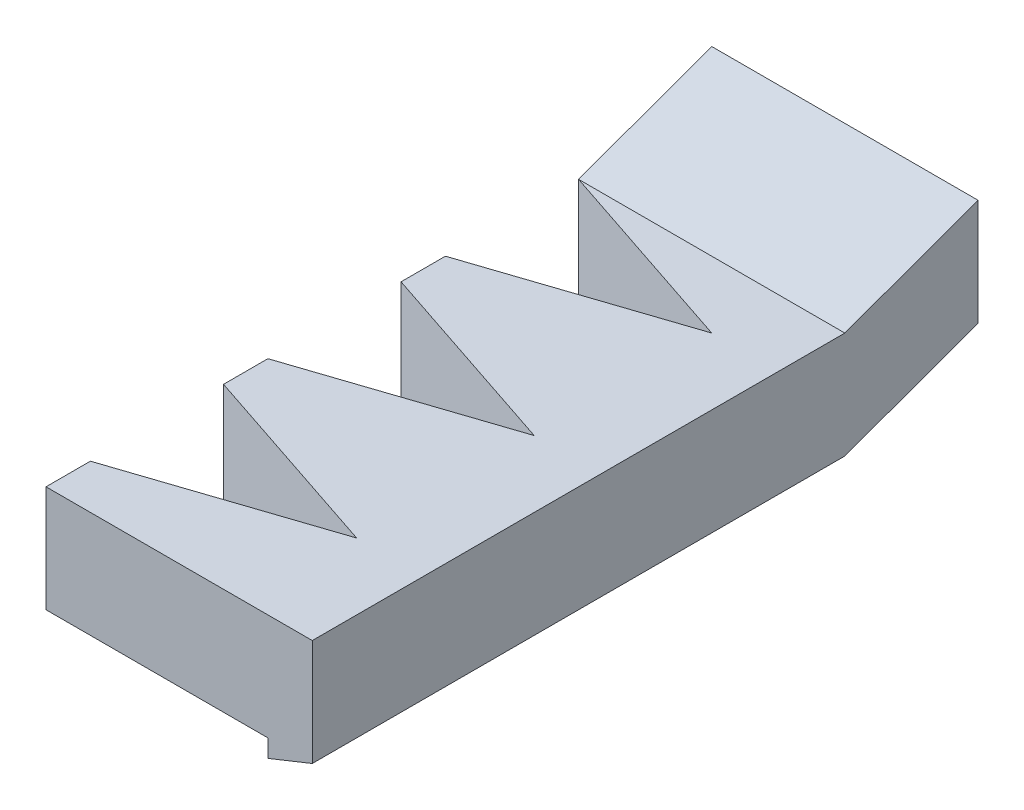
ISO-10303-21;
HEADER;
FILE_DESCRIPTION(('STEP AP214'),'2;1');
FILE_NAME('part.step','',(''),(''),'','','');
FILE_SCHEMA(('AUTOMOTIVE_DESIGN { 1 0 10303 214 1 1 1 1 }'));
ENDSEC;
DATA;
#1=APPLICATION_CONTEXT('core data for automotive mechanical design processes');
#2=APPLICATION_PROTOCOL_DEFINITION('international standard','automotive_design',2000,#1);
#3=PRODUCT_CONTEXT('',#1,'mechanical');
#4=PRODUCT('Part','Part','',(#3));
#5=PRODUCT_RELATED_PRODUCT_CATEGORY('part','',(#4));
#6=PRODUCT_DEFINITION_FORMATION('','',#4);
#7=PRODUCT_DEFINITION_CONTEXT('part definition',#1,'design');
#8=PRODUCT_DEFINITION('design','',#6,#7);
#9=PRODUCT_DEFINITION_SHAPE('','',#8);
#10=(LENGTH_UNIT() NAMED_UNIT(*) SI_UNIT(.MILLI.,.METRE.));
#11=(NAMED_UNIT(*) PLANE_ANGLE_UNIT() SI_UNIT($,.RADIAN.));
#12=(NAMED_UNIT(*) SI_UNIT($,.STERADIAN.) SOLID_ANGLE_UNIT());
#13=UNCERTAINTY_MEASURE_WITH_UNIT(LENGTH_MEASURE(1.E-05),#10,'distance_accuracy_value','');
#14=(GEOMETRIC_REPRESENTATION_CONTEXT(3) GLOBAL_UNCERTAINTY_ASSIGNED_CONTEXT((#13)) GLOBAL_UNIT_ASSIGNED_CONTEXT((#10,
#11,#12)) REPRESENTATION_CONTEXT('',''));
#15=CARTESIAN_POINT('',(0.,0.,0.));
#16=DIRECTION('',(0.,0.,1.));
#17=DIRECTION('',(1.,0.,0.));
#18=AXIS2_PLACEMENT_3D('',#15,#16,#17);
#19=CARTESIAN_POINT('',(0.,12.,0.));
#20=DIRECTION('',(1.,0.,0.));
#21=DIRECTION('',(0.,0.,-1.));
#22=AXIS2_PLACEMENT_3D('',#19,#20,#21);
#23=PLANE('',#22);
#24=DIRECTION('',(0.,-0.342020143325663,0.93969262078591));
#25=VECTOR('',#24,1.);
#26=CARTESIAN_POINT('',(0.,5.45955351399294,-75.));
#27=LINE('',#26,#25);
#28=CARTESIAN_POINT('',(0.,5.45955351399294,-75.));
#29=VERTEX_POINT('',#28);
#30=CARTESIAN_POINT('',(0.,0.,-60.));
#31=VERTEX_POINT('',#30);
#32=EDGE_CURVE('E444',#29,#31,#27,.T.);
#33=ORIENTED_EDGE('',*,*,#32,.T.);
#34=DIRECTION('',(0.,-1.,0.));
#35=VECTOR('',#34,1.);
#36=CARTESIAN_POINT('',(0.,39.0416345659799,-60.));
#37=LINE('',#36,#35);
#38=CARTESIAN_POINT('',(0.,12.,-60.));
#39=VERTEX_POINT('',#38);
#40=EDGE_CURVE('E495',#39,#31,#37,.T.);
#41=ORIENTED_EDGE('',*,*,#40,.F.);
#42=DIRECTION('',(0.,0.342020143325662,-0.939692620785911));
#43=VECTOR('',#42,1.);
#44=CARTESIAN_POINT('',(0.,17.4595535139929,-75.));
#45=LINE('',#44,#43);
#46=CARTESIAN_POINT('',(0.,17.4595535139929,-75.));
#47=VERTEX_POINT('',#46);
#48=EDGE_CURVE('E446',#39,#47,#45,.T.);
#49=ORIENTED_EDGE('',*,*,#48,.T.);
#50=DIRECTION('',(0.,-1.,0.));
#51=VECTOR('',#50,1.);
#52=CARTESIAN_POINT('',(0.,12.,-75.));
#53=LINE('',#52,#51);
#54=EDGE_CURVE('E382',#47,#29,#53,.T.);
#55=ORIENTED_EDGE('',*,*,#54,.T.);
#56=EDGE_LOOP('',(#33,#41,#49,#55));
#57=FACE_BOUND('',#56,.T.);
#58=ADVANCED_FACE('F190',(#57),#23,.F.);
#59=CARTESIAN_POINT('',(0.,0.,0.));
#60=DIRECTION('',(0.,-1.,0.));
#61=DIRECTION('',(0.,0.,-1.));
#62=AXIS2_PLACEMENT_3D('',#59,#60,#61);
#63=PLANE('',#62);
#64=DIRECTION('',(1.,0.,0.));
#65=VECTOR('',#64,1.);
#66=CARTESIAN_POINT('',(27.5,0.,-5.));
#67=LINE('',#66,#65);
#68=CARTESIAN_POINT('',(25.,0.,-5.));
#69=VERTEX_POINT('',#68);
#70=CARTESIAN_POINT('',(30.,0.,-5.));
#71=VERTEX_POINT('',#70);
#72=EDGE_CURVE('E360',#69,#71,#67,.T.);
#73=ORIENTED_EDGE('',*,*,#72,.F.);
#74=DIRECTION('',(0.,0.,-1.));
#75=VECTOR('',#74,1.);
#76=CARTESIAN_POINT('',(25.,0.,0.));
#77=LINE('',#76,#75);
#78=CARTESIAN_POINT('',(25.,0.,0.));
#79=VERTEX_POINT('',#78);
#80=EDGE_CURVE('E347',#79,#69,#77,.T.);
#81=ORIENTED_EDGE('',*,*,#80,.F.);
#82=DIRECTION('',(1.,0.,0.));
#83=VECTOR('',#82,1.);
#84=CARTESIAN_POINT('',(0.,0.,0.));
#85=LINE('',#84,#83);
#86=CARTESIAN_POINT('',(0.,0.,0.));
#87=VERTEX_POINT('',#86);
#88=EDGE_CURVE('E358',#87,#79,#85,.T.);
#89=ORIENTED_EDGE('',*,*,#88,.F.);
#90=DIRECTION('',(0.,0.,1.));
#91=VECTOR('',#90,1.);
#92=CARTESIAN_POINT('',(0.,0.,0.));
#93=LINE('',#92,#91);
#94=CARTESIAN_POINT('',(0.,0.,-5.));
#95=VERTEX_POINT('',#94);
#96=EDGE_CURVE('E376',#95,#87,#93,.T.);
#97=ORIENTED_EDGE('',*,*,#96,.F.);
#98=DIRECTION('',(0.948683298050514,0.,-0.316227766016838));
#99=VECTOR('',#98,1.);
#100=CARTESIAN_POINT('',(0.,0.,-5.));
#101=LINE('',#100,#99);
#102=CARTESIAN_POINT('',(22.5,0.,-12.5));
#103=VERTEX_POINT('',#102);
#104=EDGE_CURVE('E468',#95,#103,#101,.T.);
#105=ORIENTED_EDGE('',*,*,#104,.T.);
#106=DIRECTION('',(-0.948683298050514,0.,-0.316227766016838));
#107=VECTOR('',#106,1.);
#108=CARTESIAN_POINT('',(22.5,0.,-12.5));
#109=LINE('',#108,#107);
#110=CARTESIAN_POINT('',(0.,0.,-20.));
#111=VERTEX_POINT('',#110);
#112=EDGE_CURVE('E512',#103,#111,#109,.T.);
#113=ORIENTED_EDGE('',*,*,#112,.T.);
#114=CARTESIAN_POINT('',(0.,0.,-25.));
#115=VERTEX_POINT('',#114);
#116=EDGE_CURVE('E374',#115,#111,#93,.T.);
#117=ORIENTED_EDGE('',*,*,#116,.F.);
#118=DIRECTION('',(0.948683298050514,0.,-0.316227766016838));
#119=VECTOR('',#118,1.);
#120=CARTESIAN_POINT('',(0.,0.,-25.));
#121=LINE('',#120,#119);
#122=CARTESIAN_POINT('',(22.5,0.,-32.5));
#123=VERTEX_POINT('',#122);
#124=EDGE_CURVE('E470',#115,#123,#121,.T.);
#125=ORIENTED_EDGE('',*,*,#124,.T.);
#126=DIRECTION('',(-0.948683298050514,0.,-0.316227766016838));
#127=VECTOR('',#126,1.);
#128=CARTESIAN_POINT('',(22.5,0.,-32.5));
#129=LINE('',#128,#127);
#130=CARTESIAN_POINT('',(0.,0.,-40.));
#131=VERTEX_POINT('',#130);
#132=EDGE_CURVE('E473',#123,#131,#129,.T.);
#133=ORIENTED_EDGE('',*,*,#132,.T.);
#134=CARTESIAN_POINT('',(0.,0.,-45.));
#135=VERTEX_POINT('',#134);
#136=EDGE_CURVE('E368',#135,#131,#93,.T.);
#137=ORIENTED_EDGE('',*,*,#136,.F.);
#138=DIRECTION('',(0.948683298050514,0.,-0.316227766016838));
#139=VECTOR('',#138,1.);
#140=CARTESIAN_POINT('',(0.,0.,-45.));
#141=LINE('',#140,#139);
#142=CARTESIAN_POINT('',(22.5,0.,-52.5));
#143=VERTEX_POINT('',#142);
#144=EDGE_CURVE('E457',#135,#143,#141,.T.);
#145=ORIENTED_EDGE('',*,*,#144,.T.);
#146=DIRECTION('',(-0.948683298050514,0.,-0.316227766016838));
#147=VECTOR('',#146,1.);
#148=CARTESIAN_POINT('',(22.5,0.,-52.5));
#149=LINE('',#148,#147);
#150=EDGE_CURVE('E492',#143,#31,#149,.T.);
#151=ORIENTED_EDGE('',*,*,#150,.T.);
#152=DIRECTION('',(-1.,0.,0.));
#153=VECTOR('',#152,1.);
#154=CARTESIAN_POINT('',(45.9626665871386,0.,-60.));
#155=LINE('',#154,#153);
#156=CARTESIAN_POINT('',(30.,0.,-60.));
#157=VERTEX_POINT('',#156);
#158=EDGE_CURVE('E458',#157,#31,#155,.T.);
#159=ORIENTED_EDGE('',*,*,#158,.F.);
#160=DIRECTION('',(0.,0.,-1.));
#161=VECTOR('',#160,1.);
#162=CARTESIAN_POINT('',(30.,0.,0.));
#163=LINE('',#162,#161);
#164=CARTESIAN_POINT('',(30.,0.,-45.));
#165=VERTEX_POINT('',#164);
#166=EDGE_CURVE('E367',#165,#157,#163,.T.);
#167=ORIENTED_EDGE('',*,*,#166,.F.);
#168=DIRECTION('',(1.,0.,0.));
#169=VECTOR('',#168,1.);
#170=CARTESIAN_POINT('',(27.5,0.,-45.));
#171=LINE('',#170,#169);
#172=CARTESIAN_POINT('',(25.,0.,-45.));
#173=VERTEX_POINT('',#172);
#174=EDGE_CURVE('E450',#173,#165,#171,.T.);
#175=ORIENTED_EDGE('',*,*,#174,.F.);
#176=DIRECTION('',(0.,0.,-1.));
#177=VECTOR('',#176,1.);
#178=CARTESIAN_POINT('',(25.,0.,-40.));
#179=LINE('',#178,#177);
#180=CARTESIAN_POINT('',(25.,0.,-40.));
#181=VERTEX_POINT('',#180);
#182=EDGE_CURVE('E213',#181,#173,#179,.T.);
#183=ORIENTED_EDGE('',*,*,#182,.F.);
#184=DIRECTION('',(-1.,0.,0.));
#185=VECTOR('',#184,1.);
#186=CARTESIAN_POINT('',(27.5,0.,-40.));
#187=LINE('',#186,#185);
#188=CARTESIAN_POINT('',(30.,0.,-40.));
#189=VERTEX_POINT('',#188);
#190=EDGE_CURVE('E416',#189,#181,#187,.T.);
#191=ORIENTED_EDGE('',*,*,#190,.F.);
#192=CARTESIAN_POINT('',(30.,0.,-25.));
#193=VERTEX_POINT('',#192);
#194=EDGE_CURVE('E370',#193,#189,#163,.T.);
#195=ORIENTED_EDGE('',*,*,#194,.F.);
#196=DIRECTION('',(1.,0.,0.));
#197=VECTOR('',#196,1.);
#198=CARTESIAN_POINT('',(27.5,0.,-25.));
#199=LINE('',#198,#197);
#200=CARTESIAN_POINT('',(25.,0.,-25.));
#201=VERTEX_POINT('',#200);
#202=EDGE_CURVE('E441',#201,#193,#199,.T.);
#203=ORIENTED_EDGE('',*,*,#202,.F.);
#204=DIRECTION('',(0.,0.,-1.));
#205=VECTOR('',#204,1.);
#206=CARTESIAN_POINT('',(25.,0.,-20.));
#207=LINE('',#206,#205);
#208=CARTESIAN_POINT('',(25.,0.,-20.));
#209=VERTEX_POINT('',#208);
#210=EDGE_CURVE('E833',#209,#201,#207,.T.);
#211=ORIENTED_EDGE('',*,*,#210,.F.);
#212=DIRECTION('',(-1.,0.,0.));
#213=VECTOR('',#212,1.);
#214=CARTESIAN_POINT('',(27.5,0.,-20.));
#215=LINE('',#214,#213);
#216=CARTESIAN_POINT('',(30.,0.,-20.));
#217=VERTEX_POINT('',#216);
#218=EDGE_CURVE('E407',#217,#209,#215,.T.);
#219=ORIENTED_EDGE('',*,*,#218,.F.);
#220=EDGE_CURVE('E381',#71,#217,#163,.T.);
#221=ORIENTED_EDGE('',*,*,#220,.F.);
#222=EDGE_LOOP('',(#73,#81,#89,#97,#105,#113,#117,#125,#133,#137,#145,#151,#159,#167,#175,#183,
#191,#195,#203,#211,#219,#221));
#223=FACE_BOUND('',#222,.T.);
#224=ADVANCED_FACE('F356',(#223),#63,.T.);
#225=CARTESIAN_POINT('',(30.,12.,0.));
#226=DIRECTION('',(-1.,0.,0.));
#227=DIRECTION('',(0.,0.,1.));
#228=AXIS2_PLACEMENT_3D('',#225,#226,#227);
#229=PLANE('',#228);
#230=DIRECTION('',(0.,0.342020143325663,-0.93969262078591));
#231=VECTOR('',#230,1.);
#232=CARTESIAN_POINT('',(30.,5.45955351399294,-75.));
#233=LINE('',#232,#231);
#234=CARTESIAN_POINT('',(30.,5.45955351399294,-75.));
#235=VERTEX_POINT('',#234);
#236=EDGE_CURVE('E455',#157,#235,#233,.T.);
#237=ORIENTED_EDGE('',*,*,#236,.T.);
#238=DIRECTION('',(0.,-1.,0.));
#239=VECTOR('',#238,1.);
#240=CARTESIAN_POINT('',(30.,12.,-75.));
#241=LINE('',#240,#239);
#242=CARTESIAN_POINT('',(30.,17.4595535139929,-75.));
#243=VERTEX_POINT('',#242);
#244=EDGE_CURVE('E385',#243,#235,#241,.T.);
#245=ORIENTED_EDGE('',*,*,#244,.F.);
#246=DIRECTION('',(0.,-0.342020143325662,0.939692620785911));
#247=VECTOR('',#246,1.);
#248=CARTESIAN_POINT('',(30.,17.4595535139929,-75.));
#249=LINE('',#248,#247);
#250=CARTESIAN_POINT('',(30.,12.,-60.));
#251=VERTEX_POINT('',#250);
#252=EDGE_CURVE('E442',#243,#251,#249,.T.);
#253=ORIENTED_EDGE('',*,*,#252,.T.);
#254=DIRECTION('',(0.,0.,-1.));
#255=VECTOR('',#254,1.);
#256=CARTESIAN_POINT('',(30.,12.,0.));
#257=LINE('',#256,#255);
#258=CARTESIAN_POINT('',(30.,12.,0.));
#259=VERTEX_POINT('',#258);
#260=EDGE_CURVE('E386',#259,#251,#257,.T.);
#261=ORIENTED_EDGE('',*,*,#260,.F.);
#262=DIRECTION('',(0.,-1.,0.));
#263=VECTOR('',#262,1.);
#264=CARTESIAN_POINT('',(30.,12.,0.));
#265=LINE('',#264,#263);
#266=CARTESIAN_POINT('',(30.,0.,0.));
#267=VERTEX_POINT('',#266);
#268=EDGE_CURVE('E198',#259,#267,#265,.T.);
#269=ORIENTED_EDGE('',*,*,#268,.T.);
#270=EDGE_CURVE('E372',#267,#71,#163,.T.);
#271=ORIENTED_EDGE('',*,*,#270,.T.);
#272=ORIENTED_EDGE('',*,*,#220,.T.);
#273=DIRECTION('',(0.,0.,1.));
#274=VECTOR('',#273,1.);
#275=CARTESIAN_POINT('',(30.,0.,-22.5));
#276=LINE('',#275,#274);
#277=EDGE_CURVE('E414',#193,#217,#276,.T.);
#278=ORIENTED_EDGE('',*,*,#277,.F.);
#279=ORIENTED_EDGE('',*,*,#194,.T.);
#280=DIRECTION('',(0.,0.,1.));
#281=VECTOR('',#280,1.);
#282=CARTESIAN_POINT('',(30.,0.,-42.5));
#283=LINE('',#282,#281);
#284=EDGE_CURVE('E412',#165,#189,#283,.T.);
#285=ORIENTED_EDGE('',*,*,#284,.F.);
#286=ORIENTED_EDGE('',*,*,#166,.T.);
#287=EDGE_LOOP('',(#237,#245,#253,#261,#269,#271,#272,#278,#279,#285,#286));
#288=FACE_BOUND('',#287,.T.);
#289=ADVANCED_FACE('F393',(#288),#229,.F.);
#290=CARTESIAN_POINT('',(0.,12.,-75.));
#291=DIRECTION('',(0.,0.,1.));
#292=DIRECTION('',(1.,0.,0.));
#293=AXIS2_PLACEMENT_3D('',#290,#291,#292);
#294=PLANE('',#293);
#295=DIRECTION('',(-1.,0.,0.));
#296=VECTOR('',#295,1.);
#297=CARTESIAN_POINT('',(45.9626665871386,5.45955351399294,-75.));
#298=LINE('',#297,#296);
#299=EDGE_CURVE('E461',#235,#29,#298,.T.);
#300=ORIENTED_EDGE('',*,*,#299,.T.);
#301=ORIENTED_EDGE('',*,*,#54,.F.);
#302=DIRECTION('',(-1.,0.,0.));
#303=VECTOR('',#302,1.);
#304=CARTESIAN_POINT('',(45.9626665871386,17.4595535139929,-75.));
#305=LINE('',#304,#303);
#306=EDGE_CURVE('E449',#243,#47,#305,.T.);
#307=ORIENTED_EDGE('',*,*,#306,.F.);
#308=ORIENTED_EDGE('',*,*,#244,.T.);
#309=EDGE_LOOP('',(#300,#301,#307,#308));
#310=FACE_BOUND('',#309,.T.);
#311=ADVANCED_FACE('F566',(#310),#294,.F.);
#312=DIRECTION('',(0.,-1.,0.));
#313=VECTOR('',#312,1.);
#314=CARTESIAN_POINT('',(0.,39.0416345659799,-40.));
#315=LINE('',#314,#313);
#316=CARTESIAN_POINT('',(0.,12.,-40.));
#317=VERTEX_POINT('',#316);
#318=EDGE_CURVE('E477',#317,#131,#315,.T.);
#319=ORIENTED_EDGE('',*,*,#318,.F.);
#320=DIRECTION('',(0.,0.,1.));
#321=VECTOR('',#320,1.);
#322=CARTESIAN_POINT('',(0.,12.,0.));
#323=LINE('',#322,#321);
#324=CARTESIAN_POINT('',(0.,12.,-45.));
#325=VERTEX_POINT('',#324);
#326=EDGE_CURVE('E528',#325,#317,#323,.T.);
#327=ORIENTED_EDGE('',*,*,#326,.F.);
#328=DIRECTION('',(0.,-1.,0.));
#329=VECTOR('',#328,1.);
#330=CARTESIAN_POINT('',(0.,39.0416345659799,-45.));
#331=LINE('',#330,#329);
#332=EDGE_CURVE('E501',#325,#135,#331,.T.);
#333=ORIENTED_EDGE('',*,*,#332,.T.);
#334=ORIENTED_EDGE('',*,*,#136,.T.);
#335=EDGE_LOOP('',(#319,#327,#333,#334));
#336=FACE_BOUND('',#335,.T.);
#337=ADVANCED_FACE('F192',(#336),#23,.F.);
#338=DIRECTION('',(0.,-1.,0.));
#339=VECTOR('',#338,1.);
#340=CARTESIAN_POINT('',(0.,39.0416345659799,-25.));
#341=LINE('',#340,#339);
#342=CARTESIAN_POINT('',(0.,12.,-25.));
#343=VERTEX_POINT('',#342);
#344=EDGE_CURVE('E482',#343,#115,#341,.T.);
#345=ORIENTED_EDGE('',*,*,#344,.T.);
#346=ORIENTED_EDGE('',*,*,#116,.T.);
#347=DIRECTION('',(0.,-1.,0.));
#348=VECTOR('',#347,1.);
#349=CARTESIAN_POINT('',(0.,39.0416345659799,-20.));
#350=LINE('',#349,#348);
#351=CARTESIAN_POINT('',(0.,12.,-20.));
#352=VERTEX_POINT('',#351);
#353=EDGE_CURVE('E515',#352,#111,#350,.T.);
#354=ORIENTED_EDGE('',*,*,#353,.F.);
#355=EDGE_CURVE('E526',#343,#352,#323,.T.);
#356=ORIENTED_EDGE('',*,*,#355,.F.);
#357=EDGE_LOOP('',(#345,#346,#354,#356));
#358=FACE_BOUND('',#357,.T.);
#359=ADVANCED_FACE('F548',(#358),#23,.F.);
#360=CARTESIAN_POINT('',(0.,12.,0.));
#361=DIRECTION('',(0.,-1.,0.));
#362=DIRECTION('',(0.,0.,-1.));
#363=AXIS2_PLACEMENT_3D('',#360,#361,#362);
#364=PLANE('',#363);
#365=ORIENTED_EDGE('',*,*,#260,.T.);
#366=DIRECTION('',(-1.,0.,0.));
#367=VECTOR('',#366,1.);
#368=CARTESIAN_POINT('',(45.9626665871386,12.,-60.));
#369=LINE('',#368,#367);
#370=EDGE_CURVE('E445',#251,#39,#369,.T.);
#371=ORIENTED_EDGE('',*,*,#370,.T.);
#372=DIRECTION('',(0.948683298050514,0.,0.316227766016838));
#373=VECTOR('',#372,1.);
#374=CARTESIAN_POINT('',(22.5,12.,-52.5));
#375=LINE('',#374,#373);
#376=CARTESIAN_POINT('',(22.5,12.,-52.5));
#377=VERTEX_POINT('',#376);
#378=EDGE_CURVE('E489',#39,#377,#375,.T.);
#379=ORIENTED_EDGE('',*,*,#378,.T.);
#380=DIRECTION('',(-0.948683298050514,0.,0.316227766016838));
#381=VECTOR('',#380,1.);
#382=CARTESIAN_POINT('',(0.,12.,-45.));
#383=LINE('',#382,#381);
#384=EDGE_CURVE('E474',#377,#325,#383,.T.);
#385=ORIENTED_EDGE('',*,*,#384,.T.);
#386=ORIENTED_EDGE('',*,*,#326,.T.);
#387=DIRECTION('',(0.948683298050514,0.,0.316227766016838));
#388=VECTOR('',#387,1.);
#389=CARTESIAN_POINT('',(22.5,12.,-32.5));
#390=LINE('',#389,#388);
#391=CARTESIAN_POINT('',(22.5,12.,-32.5));
#392=VERTEX_POINT('',#391);
#393=EDGE_CURVE('E469',#317,#392,#390,.T.);
#394=ORIENTED_EDGE('',*,*,#393,.T.);
#395=DIRECTION('',(-0.948683298050514,0.,0.316227766016838));
#396=VECTOR('',#395,1.);
#397=CARTESIAN_POINT('',(0.,12.,-25.));
#398=LINE('',#397,#396);
#399=EDGE_CURVE('E465',#392,#343,#398,.T.);
#400=ORIENTED_EDGE('',*,*,#399,.T.);
#401=ORIENTED_EDGE('',*,*,#355,.T.);
#402=DIRECTION('',(0.948683298050514,0.,0.316227766016838));
#403=VECTOR('',#402,1.);
#404=CARTESIAN_POINT('',(22.5,12.,-12.5));
#405=LINE('',#404,#403);
#406=CARTESIAN_POINT('',(22.5,12.,-12.5));
#407=VERTEX_POINT('',#406);
#408=EDGE_CURVE('E509',#352,#407,#405,.T.);
#409=ORIENTED_EDGE('',*,*,#408,.T.);
#410=DIRECTION('',(-0.948683298050514,0.,0.316227766016838));
#411=VECTOR('',#410,1.);
#412=CARTESIAN_POINT('',(0.,12.,-5.));
#413=LINE('',#412,#411);
#414=CARTESIAN_POINT('',(0.,12.,-5.));
#415=VERTEX_POINT('',#414);
#416=EDGE_CURVE('E506',#407,#415,#413,.T.);
#417=ORIENTED_EDGE('',*,*,#416,.T.);
#418=CARTESIAN_POINT('',(0.,12.,0.));
#419=VERTEX_POINT('',#418);
#420=EDGE_CURVE('E380',#415,#419,#323,.T.);
#421=ORIENTED_EDGE('',*,*,#420,.T.);
#422=DIRECTION('',(1.,0.,0.));
#423=VECTOR('',#422,1.);
#424=CARTESIAN_POINT('',(0.,12.,0.));
#425=LINE('',#424,#423);
#426=EDGE_CURVE('E396',#419,#259,#425,.T.);
#427=ORIENTED_EDGE('',*,*,#426,.T.);
#428=EDGE_LOOP('',(#365,#371,#379,#385,#386,#394,#400,#401,#409,#417,#421,#427));
#429=FACE_BOUND('',#428,.T.);
#430=ADVANCED_FACE('F530',(#429),#364,.F.);
#431=DIRECTION('',(0.,-1.,0.));
#432=VECTOR('',#431,1.);
#433=CARTESIAN_POINT('',(0.,39.0416345659799,-5.));
#434=LINE('',#433,#432);
#435=EDGE_CURVE('E521',#415,#95,#434,.T.);
#436=ORIENTED_EDGE('',*,*,#435,.T.);
#437=ORIENTED_EDGE('',*,*,#96,.T.);
#438=DIRECTION('',(0.,-1.,0.));
#439=VECTOR('',#438,1.);
#440=CARTESIAN_POINT('',(0.,12.,0.));
#441=LINE('',#440,#439);
#442=EDGE_CURVE('E13',#419,#87,#441,.T.);
#443=ORIENTED_EDGE('',*,*,#442,.F.);
#444=ORIENTED_EDGE('',*,*,#420,.F.);
#445=EDGE_LOOP('',(#436,#437,#443,#444));
#446=FACE_BOUND('',#445,.T.);
#447=ADVANCED_FACE('F556',(#446),#23,.F.);
#448=CARTESIAN_POINT('',(0.,12.,0.));
#449=DIRECTION('',(0.,0.,-1.));
#450=DIRECTION('',(-1.,0.,0.));
#451=AXIS2_PLACEMENT_3D('',#448,#449,#450);
#452=PLANE('',#451);
#453=ORIENTED_EDGE('',*,*,#88,.T.);
#454=DIRECTION('',(0.,1.,0.));
#455=VECTOR('',#454,1.);
#456=CARTESIAN_POINT('',(25.,-1.,0.));
#457=LINE('',#456,#455);
#458=CARTESIAN_POINT('',(25.,-2.,0.));
#459=VERTEX_POINT('',#458);
#460=EDGE_CURVE('E343',#459,#79,#457,.T.);
#461=ORIENTED_EDGE('',*,*,#460,.F.);
#462=DIRECTION('',(-0.928476690885259,-0.371390676354104,0.));
#463=VECTOR('',#462,1.);
#464=CARTESIAN_POINT('',(27.5,-1.,0.));
#465=LINE('',#464,#463);
#466=EDGE_CURVE('E361',#267,#459,#465,.T.);
#467=ORIENTED_EDGE('',*,*,#466,.F.);
#468=ORIENTED_EDGE('',*,*,#268,.F.);
#469=ORIENTED_EDGE('',*,*,#426,.F.);
#470=ORIENTED_EDGE('',*,*,#442,.T.);
#471=EDGE_LOOP('',(#453,#461,#467,#468,#469,#470));
#472=FACE_BOUND('',#471,.T.);
#473=ADVANCED_FACE('F364',(#472),#452,.F.);
#474=CARTESIAN_POINT('',(22.5,39.0416345659799,-12.5));
#475=DIRECTION('',(-0.316227766016838,0.,0.948683298050514));
#476=DIRECTION('',(0.948683298050514,0.,0.316227766016838));
#477=AXIS2_PLACEMENT_3D('',#474,#475,#476);
#478=PLANE('',#477);
#479=ORIENTED_EDGE('',*,*,#353,.T.);
#480=ORIENTED_EDGE('',*,*,#112,.F.);
#481=DIRECTION('',(0.,-1.,0.));
#482=VECTOR('',#481,1.);
#483=CARTESIAN_POINT('',(22.5,39.0416345659799,-12.5));
#484=LINE('',#483,#482);
#485=EDGE_CURVE('E518',#407,#103,#484,.T.);
#486=ORIENTED_EDGE('',*,*,#485,.F.);
#487=ORIENTED_EDGE('',*,*,#408,.F.);
#488=EDGE_LOOP('',(#479,#480,#486,#487));
#489=FACE_BOUND('',#488,.T.);
#490=ADVANCED_FACE('F553',(#489),#478,.T.);
#491=CARTESIAN_POINT('',(0.,39.0416345659799,-5.));
#492=DIRECTION('',(-0.316227766016838,0.,-0.948683298050514));
#493=DIRECTION('',(-0.948683298050514,0.,0.316227766016838));
#494=AXIS2_PLACEMENT_3D('',#491,#492,#493);
#495=PLANE('',#494);
#496=ORIENTED_EDGE('',*,*,#485,.T.);
#497=ORIENTED_EDGE('',*,*,#104,.F.);
#498=ORIENTED_EDGE('',*,*,#435,.F.);
#499=ORIENTED_EDGE('',*,*,#416,.F.);
#500=EDGE_LOOP('',(#496,#497,#498,#499));
#501=FACE_BOUND('',#500,.T.);
#502=ADVANCED_FACE('F555',(#501),#495,.T.);
#503=CARTESIAN_POINT('',(22.5,39.0416345659799,-52.5));
#504=DIRECTION('',(-0.316227766016838,0.,0.948683298050514));
#505=DIRECTION('',(0.948683298050514,0.,0.316227766016838));
#506=AXIS2_PLACEMENT_3D('',#503,#504,#505);
#507=PLANE('',#506);
#508=ORIENTED_EDGE('',*,*,#40,.T.);
#509=ORIENTED_EDGE('',*,*,#150,.F.);
#510=DIRECTION('',(0.,-1.,0.));
#511=VECTOR('',#510,1.);
#512=CARTESIAN_POINT('',(22.5,39.0416345659799,-52.5));
#513=LINE('',#512,#511);
#514=EDGE_CURVE('E498',#377,#143,#513,.T.);
#515=ORIENTED_EDGE('',*,*,#514,.F.);
#516=ORIENTED_EDGE('',*,*,#378,.F.);
#517=EDGE_LOOP('',(#508,#509,#515,#516));
#518=FACE_BOUND('',#517,.T.);
#519=ADVANCED_FACE('F579',(#518),#507,.T.);
#520=CARTESIAN_POINT('',(0.,39.0416345659799,-45.));
#521=DIRECTION('',(-0.316227766016838,0.,-0.948683298050514));
#522=DIRECTION('',(-0.948683298050514,0.,0.316227766016838));
#523=AXIS2_PLACEMENT_3D('',#520,#521,#522);
#524=PLANE('',#523);
#525=ORIENTED_EDGE('',*,*,#514,.T.);
#526=ORIENTED_EDGE('',*,*,#144,.F.);
#527=ORIENTED_EDGE('',*,*,#332,.F.);
#528=ORIENTED_EDGE('',*,*,#384,.F.);
#529=EDGE_LOOP('',(#525,#526,#527,#528));
#530=FACE_BOUND('',#529,.T.);
#531=ADVANCED_FACE('F583',(#530),#524,.T.);
#532=CARTESIAN_POINT('',(22.5,39.0416345659799,-32.5));
#533=DIRECTION('',(-0.316227766016838,0.,0.948683298050514));
#534=DIRECTION('',(0.948683298050514,0.,0.316227766016838));
#535=AXIS2_PLACEMENT_3D('',#532,#533,#534);
#536=PLANE('',#535);
#537=ORIENTED_EDGE('',*,*,#318,.T.);
#538=ORIENTED_EDGE('',*,*,#132,.F.);
#539=DIRECTION('',(0.,-1.,0.));
#540=VECTOR('',#539,1.);
#541=CARTESIAN_POINT('',(22.5,39.0416345659799,-32.5));
#542=LINE('',#541,#540);
#543=EDGE_CURVE('E479',#392,#123,#542,.T.);
#544=ORIENTED_EDGE('',*,*,#543,.F.);
#545=ORIENTED_EDGE('',*,*,#393,.F.);
#546=EDGE_LOOP('',(#537,#538,#544,#545));
#547=FACE_BOUND('',#546,.T.);
#548=ADVANCED_FACE('F541',(#547),#536,.T.);
#549=CARTESIAN_POINT('',(0.,39.0416345659799,-25.));
#550=DIRECTION('',(-0.316227766016838,0.,-0.948683298050514));
#551=DIRECTION('',(-0.948683298050514,0.,0.316227766016838));
#552=AXIS2_PLACEMENT_3D('',#549,#550,#551);
#553=PLANE('',#552);
#554=ORIENTED_EDGE('',*,*,#543,.T.);
#555=ORIENTED_EDGE('',*,*,#124,.F.);
#556=ORIENTED_EDGE('',*,*,#344,.F.);
#557=ORIENTED_EDGE('',*,*,#399,.F.);
#558=EDGE_LOOP('',(#554,#555,#556,#557));
#559=FACE_BOUND('',#558,.T.);
#560=ADVANCED_FACE('F545',(#559),#553,.T.);
#561=CARTESIAN_POINT('',(45.9626665871386,5.45955351399294,-75.));
#562=DIRECTION('',(0.,-0.93969262078591,-0.342020143325663));
#563=DIRECTION('',(0.,0.342020143325663,-0.93969262078591));
#564=AXIS2_PLACEMENT_3D('',#561,#562,#563);
#565=PLANE('',#564);
#566=ORIENTED_EDGE('',*,*,#158,.T.);
#567=ORIENTED_EDGE('',*,*,#32,.F.);
#568=ORIENTED_EDGE('',*,*,#299,.F.);
#569=ORIENTED_EDGE('',*,*,#236,.F.);
#570=EDGE_LOOP('',(#566,#567,#568,#569));
#571=FACE_BOUND('',#570,.T.);
#572=ADVANCED_FACE('F696',(#571),#565,.T.);
#573=CARTESIAN_POINT('',(45.9626665871386,17.4595535139929,-75.));
#574=DIRECTION('',(0.,0.939692620785911,0.342020143325662));
#575=DIRECTION('',(0.,-0.342020143325662,0.939692620785911));
#576=AXIS2_PLACEMENT_3D('',#573,#574,#575);
#577=PLANE('',#576);
#578=ORIENTED_EDGE('',*,*,#252,.F.);
#579=ORIENTED_EDGE('',*,*,#306,.T.);
#580=ORIENTED_EDGE('',*,*,#48,.F.);
#581=ORIENTED_EDGE('',*,*,#370,.F.);
#582=EDGE_LOOP('',(#578,#579,#580,#581));
#583=FACE_BOUND('',#582,.T.);
#584=ADVANCED_FACE('F689',(#583),#577,.T.);
#585=CARTESIAN_POINT('',(25.,0.,-45.));
#586=DIRECTION('',(0.,0.,-1.));
#587=DIRECTION('',(1.,0.,0.));
#588=AXIS2_PLACEMENT_3D('',#585,#586,#587);
#589=PLANE('',#588);
#590=ORIENTED_EDGE('',*,*,#174,.T.);
#591=DIRECTION('',(-0.928476690885259,-0.371390676354104,0.));
#592=VECTOR('',#591,1.);
#593=CARTESIAN_POINT('',(27.5,-1.,-45.));
#594=LINE('',#593,#592);
#595=CARTESIAN_POINT('',(25.,-2.,-45.));
#596=VERTEX_POINT('',#595);
#597=EDGE_CURVE('E427',#165,#596,#594,.T.);
#598=ORIENTED_EDGE('',*,*,#597,.T.);
#599=DIRECTION('',(0.,-1.,0.));
#600=VECTOR('',#599,1.);
#601=CARTESIAN_POINT('',(25.,-1.,-45.));
#602=LINE('',#601,#600);
#603=EDGE_CURVE('E435',#173,#596,#602,.T.);
#604=ORIENTED_EDGE('',*,*,#603,.F.);
#605=EDGE_LOOP('',(#590,#598,#604));
#606=FACE_BOUND('',#605,.T.);
#607=ADVANCED_FACE('F687',(#606),#589,.T.);
#608=CARTESIAN_POINT('',(30.,0.,-45.));
#609=DIRECTION('',(0.371390676354104,-0.928476690885259,0.));
#610=DIRECTION('',(0.,0.,1.));
#611=AXIS2_PLACEMENT_3D('',#608,#609,#610);
#612=PLANE('',#611);
#613=ORIENTED_EDGE('',*,*,#284,.T.);
#614=DIRECTION('',(-0.928476690885259,-0.371390676354104,0.));
#615=VECTOR('',#614,1.);
#616=CARTESIAN_POINT('',(27.5,-1.,-40.));
#617=LINE('',#616,#615);
#618=CARTESIAN_POINT('',(25.,-2.,-40.));
#619=VERTEX_POINT('',#618);
#620=EDGE_CURVE('E420',#189,#619,#617,.T.);
#621=ORIENTED_EDGE('',*,*,#620,.T.);
#622=DIRECTION('',(0.,0.,1.));
#623=VECTOR('',#622,1.);
#624=CARTESIAN_POINT('',(25.,-2.,-42.5));
#625=LINE('',#624,#623);
#626=EDGE_CURVE('E438',#596,#619,#625,.T.);
#627=ORIENTED_EDGE('',*,*,#626,.F.);
#628=ORIENTED_EDGE('',*,*,#597,.F.);
#629=EDGE_LOOP('',(#613,#621,#627,#628));
#630=FACE_BOUND('',#629,.T.);
#631=ADVANCED_FACE('F425',(#630),#612,.T.);
#632=CARTESIAN_POINT('',(30.,0.,-40.));
#633=DIRECTION('',(0.,0.,1.));
#634=DIRECTION('',(-1.,0.,0.));
#635=AXIS2_PLACEMENT_3D('',#632,#633,#634);
#636=PLANE('',#635);
#637=ORIENTED_EDGE('',*,*,#190,.T.);
#638=DIRECTION('',(0.,1.,0.));
#639=VECTOR('',#638,1.);
#640=CARTESIAN_POINT('',(25.,-1.,-40.));
#641=LINE('',#640,#639);
#642=EDGE_CURVE('E430',#619,#181,#641,.T.);
#643=ORIENTED_EDGE('',*,*,#642,.F.);
#644=ORIENTED_EDGE('',*,*,#620,.F.);
#645=EDGE_LOOP('',(#637,#643,#644));
#646=FACE_BOUND('',#645,.T.);
#647=ADVANCED_FACE('F429',(#646),#636,.T.);
#648=CARTESIAN_POINT('',(25.,0.,0.));
#649=DIRECTION('',(-1.,0.,0.));
#650=DIRECTION('',(0.,0.,1.));
#651=AXIS2_PLACEMENT_3D('',#648,#649,#650);
#652=PLANE('',#651);
#653=ORIENTED_EDGE('',*,*,#182,.T.);
#654=ORIENTED_EDGE('',*,*,#603,.T.);
#655=ORIENTED_EDGE('',*,*,#626,.T.);
#656=ORIENTED_EDGE('',*,*,#642,.T.);
#657=EDGE_LOOP('',(#653,#654,#655,#656));
#658=FACE_BOUND('',#657,.T.);
#659=ADVANCED_FACE('F625',(#658),#652,.T.);
#660=CARTESIAN_POINT('',(25.,0.,-25.));
#661=DIRECTION('',(0.,0.,-1.));
#662=DIRECTION('',(1.,0.,0.));
#663=AXIS2_PLACEMENT_3D('',#660,#661,#662);
#664=PLANE('',#663);
#665=ORIENTED_EDGE('',*,*,#202,.T.);
#666=DIRECTION('',(-0.928476690885259,-0.371390676354104,0.));
#667=VECTOR('',#666,1.);
#668=CARTESIAN_POINT('',(27.5,-1.,-25.));
#669=LINE('',#668,#667);
#670=CARTESIAN_POINT('',(25.,-2.,-25.));
#671=VERTEX_POINT('',#670);
#672=EDGE_CURVE('E205',#193,#671,#669,.T.);
#673=ORIENTED_EDGE('',*,*,#672,.T.);
#674=DIRECTION('',(0.,-1.,0.));
#675=VECTOR('',#674,1.);
#676=CARTESIAN_POINT('',(25.,-1.,-25.));
#677=LINE('',#676,#675);
#678=EDGE_CURVE('E830',#201,#671,#677,.T.);
#679=ORIENTED_EDGE('',*,*,#678,.F.);
#680=EDGE_LOOP('',(#665,#673,#679));
#681=FACE_BOUND('',#680,.T.);
#682=ADVANCED_FACE('F620',(#681),#664,.T.);
#683=CARTESIAN_POINT('',(30.,0.,-25.));
#684=DIRECTION('',(0.371390676354104,-0.928476690885259,0.));
#685=DIRECTION('',(0.,0.,1.));
#686=AXIS2_PLACEMENT_3D('',#683,#684,#685);
#687=PLANE('',#686);
#688=ORIENTED_EDGE('',*,*,#277,.T.);
#689=DIRECTION('',(-0.928476690885259,-0.371390676354104,0.));
#690=VECTOR('',#689,1.);
#691=CARTESIAN_POINT('',(27.5,-1.,-20.));
#692=LINE('',#691,#690);
#693=CARTESIAN_POINT('',(25.,-2.,-20.));
#694=VERTEX_POINT('',#693);
#695=EDGE_CURVE('E835',#217,#694,#692,.T.);
#696=ORIENTED_EDGE('',*,*,#695,.T.);
#697=DIRECTION('',(0.,0.,1.));
#698=VECTOR('',#697,1.);
#699=CARTESIAN_POINT('',(25.,-2.,-22.5));
#700=LINE('',#699,#698);
#701=EDGE_CURVE('E827',#671,#694,#700,.T.);
#702=ORIENTED_EDGE('',*,*,#701,.F.);
#703=ORIENTED_EDGE('',*,*,#672,.F.);
#704=EDGE_LOOP('',(#688,#696,#702,#703));
#705=FACE_BOUND('',#704,.T.);
#706=ADVANCED_FACE('F624',(#705),#687,.T.);
#707=CARTESIAN_POINT('',(30.,0.,-20.));
#708=DIRECTION('',(0.,0.,1.));
#709=DIRECTION('',(-1.,0.,0.));
#710=AXIS2_PLACEMENT_3D('',#707,#708,#709);
#711=PLANE('',#710);
#712=ORIENTED_EDGE('',*,*,#218,.T.);
#713=DIRECTION('',(0.,1.,0.));
#714=VECTOR('',#713,1.);
#715=CARTESIAN_POINT('',(25.,-1.,-20.));
#716=LINE('',#715,#714);
#717=EDGE_CURVE('E824',#694,#209,#716,.T.);
#718=ORIENTED_EDGE('',*,*,#717,.F.);
#719=ORIENTED_EDGE('',*,*,#695,.F.);
#720=EDGE_LOOP('',(#712,#718,#719));
#721=FACE_BOUND('',#720,.T.);
#722=ADVANCED_FACE('F636',(#721),#711,.T.);
#723=CARTESIAN_POINT('',(25.,0.,20.));
#724=DIRECTION('',(-1.,0.,0.));
#725=DIRECTION('',(0.,0.,1.));
#726=AXIS2_PLACEMENT_3D('',#723,#724,#725);
#727=PLANE('',#726);
#728=ORIENTED_EDGE('',*,*,#210,.T.);
#729=ORIENTED_EDGE('',*,*,#678,.T.);
#730=ORIENTED_EDGE('',*,*,#701,.T.);
#731=ORIENTED_EDGE('',*,*,#717,.T.);
#732=EDGE_LOOP('',(#728,#729,#730,#731));
#733=FACE_BOUND('',#732,.T.);
#734=ADVANCED_FACE('F645',(#733),#727,.T.);
#735=CARTESIAN_POINT('',(25.,0.,-5.));
#736=DIRECTION('',(0.,0.,-1.));
#737=DIRECTION('',(1.,0.,0.));
#738=AXIS2_PLACEMENT_3D('',#735,#736,#737);
#739=PLANE('',#738);
#740=ORIENTED_EDGE('',*,*,#72,.T.);
#741=DIRECTION('',(-0.928476690885259,-0.371390676354104,0.));
#742=VECTOR('',#741,1.);
#743=CARTESIAN_POINT('',(27.5,-1.,-5.));
#744=LINE('',#743,#742);
#745=CARTESIAN_POINT('',(25.,-2.,-5.));
#746=VERTEX_POINT('',#745);
#747=EDGE_CURVE('E398',#71,#746,#744,.T.);
#748=ORIENTED_EDGE('',*,*,#747,.T.);
#749=DIRECTION('',(0.,-1.,0.));
#750=VECTOR('',#749,1.);
#751=CARTESIAN_POINT('',(25.,-1.,-5.));
#752=LINE('',#751,#750);
#753=EDGE_CURVE('E362',#69,#746,#752,.T.);
#754=ORIENTED_EDGE('',*,*,#753,.F.);
#755=EDGE_LOOP('',(#740,#748,#754));
#756=FACE_BOUND('',#755,.T.);
#757=ADVANCED_FACE('F655',(#756),#739,.T.);
#758=CARTESIAN_POINT('',(30.,0.,-5.));
#759=DIRECTION('',(0.371390676354104,-0.928476690885259,0.));
#760=DIRECTION('',(0.,0.,1.));
#761=AXIS2_PLACEMENT_3D('',#758,#759,#760);
#762=PLANE('',#761);
#763=ORIENTED_EDGE('',*,*,#270,.F.);
#764=ORIENTED_EDGE('',*,*,#466,.T.);
#765=DIRECTION('',(0.,0.,1.));
#766=VECTOR('',#765,1.);
#767=CARTESIAN_POINT('',(25.,-2.,-2.5));
#768=LINE('',#767,#766);
#769=EDGE_CURVE('E349',#746,#459,#768,.T.);
#770=ORIENTED_EDGE('',*,*,#769,.F.);
#771=ORIENTED_EDGE('',*,*,#747,.F.);
#772=EDGE_LOOP('',(#763,#764,#770,#771));
#773=FACE_BOUND('',#772,.T.);
#774=ADVANCED_FACE('F401',(#773),#762,.T.);
#775=CARTESIAN_POINT('',(25.,0.,40.));
#776=DIRECTION('',(-1.,0.,0.));
#777=DIRECTION('',(0.,0.,1.));
#778=AXIS2_PLACEMENT_3D('',#775,#776,#777);
#779=PLANE('',#778);
#780=ORIENTED_EDGE('',*,*,#80,.T.);
#781=ORIENTED_EDGE('',*,*,#753,.T.);
#782=ORIENTED_EDGE('',*,*,#769,.T.);
#783=ORIENTED_EDGE('',*,*,#460,.T.);
#784=EDGE_LOOP('',(#780,#781,#782,#783));
#785=FACE_BOUND('',#784,.T.);
#786=ADVANCED_FACE('F345',(#785),#779,.T.);
#787=CLOSED_SHELL('',(#58,#224,#289,#311,#337,#359,#430,#447,#473,#490,#502,#519,#531,#548,#560,
#572,#584,#607,#631,#647,#659,#682,#706,#722,#734,#757,#774,#786));
#788=MANIFOLD_SOLID_BREP('B2',#787);
#789=ADVANCED_BREP_SHAPE_REPRESENTATION('',(#18,#788),#14);
#790=SHAPE_DEFINITION_REPRESENTATION(#9,#789);
ENDSEC;
END-ISO-10303-21;
